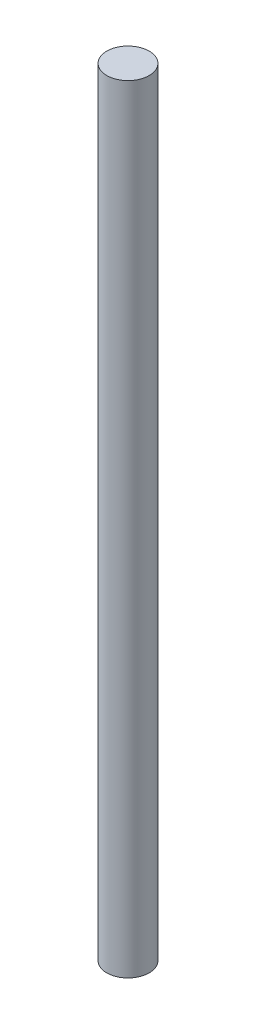
ISO-10303-21;
HEADER;
FILE_DESCRIPTION(('STEP AP214'),'2;1');
FILE_NAME('part.step','',(''),(''),'','','');
FILE_SCHEMA(('AUTOMOTIVE_DESIGN { 1 0 10303 214 1 1 1 1 }'));
ENDSEC;
DATA;
#1=APPLICATION_CONTEXT('core data for automotive mechanical design processes');
#2=APPLICATION_PROTOCOL_DEFINITION('international standard','automotive_design',2000,#1);
#3=PRODUCT_CONTEXT('',#1,'mechanical');
#4=PRODUCT('Part','Part','',(#3));
#5=PRODUCT_RELATED_PRODUCT_CATEGORY('part','',(#4));
#6=PRODUCT_DEFINITION_FORMATION('','',#4);
#7=PRODUCT_DEFINITION_CONTEXT('part definition',#1,'design');
#8=PRODUCT_DEFINITION('design','',#6,#7);
#9=PRODUCT_DEFINITION_SHAPE('','',#8);
#10=(LENGTH_UNIT() NAMED_UNIT(*) SI_UNIT(.MILLI.,.METRE.));
#11=(NAMED_UNIT(*) PLANE_ANGLE_UNIT() SI_UNIT($,.RADIAN.));
#12=(NAMED_UNIT(*) SI_UNIT($,.STERADIAN.) SOLID_ANGLE_UNIT());
#13=UNCERTAINTY_MEASURE_WITH_UNIT(LENGTH_MEASURE(1.E-05),#10,'distance_accuracy_value','');
#14=(GEOMETRIC_REPRESENTATION_CONTEXT(3) GLOBAL_UNCERTAINTY_ASSIGNED_CONTEXT((#13)) GLOBAL_UNIT_ASSIGNED_CONTEXT((#10,
#11,#12)) REPRESENTATION_CONTEXT('',''));
#15=CARTESIAN_POINT('',(0.,0.,0.));
#16=DIRECTION('',(0.,0.,1.));
#17=DIRECTION('',(1.,0.,0.));
#18=AXIS2_PLACEMENT_3D('',#15,#16,#17);
#19=CARTESIAN_POINT('',(0.,220.,0.));
#20=DIRECTION('',(0.,-1.,0.));
#21=DIRECTION('',(0.,0.,-1.));
#22=AXIS2_PLACEMENT_3D('',#19,#20,#21);
#23=CYLINDRICAL_SURFACE('',#22,6.);
#24=CARTESIAN_POINT('',(0.,220.,0.));
#25=DIRECTION('',(0.,1.,0.));
#26=DIRECTION('',(0.,0.,1.));
#27=AXIS2_PLACEMENT_3D('',#24,#25,#26);
#28=CIRCLE('',#27,6.);
#29=CARTESIAN_POINT('',(0.,220.,6.));
#30=VERTEX_POINT('',#29);
#31=EDGE_CURVE('E10',#30,#30,#28,.T.);
#32=ORIENTED_EDGE('',*,*,#31,.F.);
#33=EDGE_LOOP('',(#32));
#34=FACE_BOUND('',#33,.T.);
#35=CARTESIAN_POINT('',(0.,0.,0.));
#36=DIRECTION('',(0.,1.,0.));
#37=DIRECTION('',(0.,0.,1.));
#38=AXIS2_PLACEMENT_3D('',#35,#36,#37);
#39=CIRCLE('',#38,6.);
#40=CARTESIAN_POINT('',(0.,0.,6.));
#41=VERTEX_POINT('',#40);
#42=EDGE_CURVE('E40',#41,#41,#39,.T.);
#43=ORIENTED_EDGE('',*,*,#42,.T.);
#44=EDGE_LOOP('',(#43));
#45=FACE_BOUND('',#44,.T.);
#46=ADVANCED_FACE('F37',(#34,#45),#23,.T.);
#47=CARTESIAN_POINT('',(0.,220.,0.));
#48=DIRECTION('',(0.,1.,0.));
#49=DIRECTION('',(0.,0.,1.));
#50=AXIS2_PLACEMENT_3D('',#47,#48,#49);
#51=PLANE('',#50);
#52=ORIENTED_EDGE('',*,*,#31,.T.);
#53=EDGE_LOOP('',(#52));
#54=FACE_BOUND('',#53,.T.);
#55=ADVANCED_FACE('F54',(#54),#51,.T.);
#56=CARTESIAN_POINT('',(0.,0.,0.));
#57=DIRECTION('',(0.,1.,0.));
#58=DIRECTION('',(0.,0.,1.));
#59=AXIS2_PLACEMENT_3D('',#56,#57,#58);
#60=PLANE('',#59);
#61=ORIENTED_EDGE('',*,*,#42,.F.);
#62=EDGE_LOOP('',(#61));
#63=FACE_BOUND('',#62,.T.);
#64=ADVANCED_FACE('F52',(#63),#60,.F.);
#65=CLOSED_SHELL('',(#46,#55,#64));
#66=MANIFOLD_SOLID_BREP('B2',#65);
#67=ADVANCED_BREP_SHAPE_REPRESENTATION('',(#18,#66),#14);
#68=SHAPE_DEFINITION_REPRESENTATION(#9,#67);
ENDSEC;
END-ISO-10303-21;
